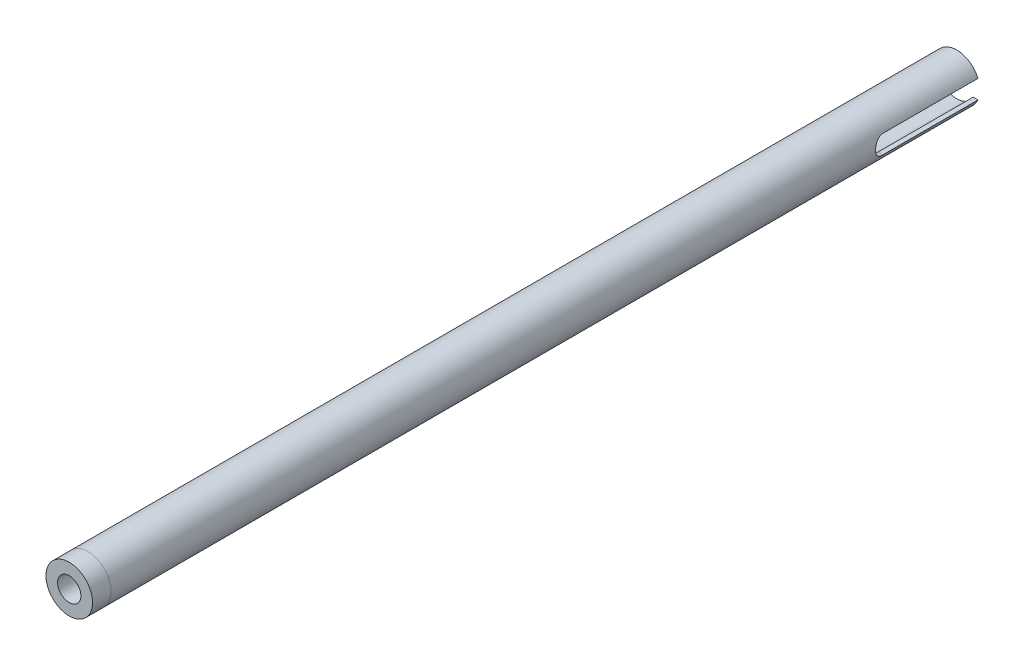
ISO-10303-21;
HEADER;
FILE_DESCRIPTION(('STEP AP214'),'2;1');
FILE_NAME('part.step','',(''),(''),'','','');
FILE_SCHEMA(('AUTOMOTIVE_DESIGN { 1 0 10303 214 1 1 1 1 }'));
ENDSEC;
DATA;
#1=APPLICATION_CONTEXT('core data for automotive mechanical design processes');
#2=APPLICATION_PROTOCOL_DEFINITION('international standard','automotive_design',2000,#1);
#3=PRODUCT_CONTEXT('',#1,'mechanical');
#4=PRODUCT('Part','Part','',(#3));
#5=PRODUCT_RELATED_PRODUCT_CATEGORY('part','',(#4));
#6=PRODUCT_DEFINITION_FORMATION('','',#4);
#7=PRODUCT_DEFINITION_CONTEXT('part definition',#1,'design');
#8=PRODUCT_DEFINITION('design','',#6,#7);
#9=PRODUCT_DEFINITION_SHAPE('','',#8);
#10=(LENGTH_UNIT() NAMED_UNIT(*) SI_UNIT(.MILLI.,.METRE.));
#11=(NAMED_UNIT(*) PLANE_ANGLE_UNIT() SI_UNIT($,.RADIAN.));
#12=(NAMED_UNIT(*) SI_UNIT($,.STERADIAN.) SOLID_ANGLE_UNIT());
#13=UNCERTAINTY_MEASURE_WITH_UNIT(LENGTH_MEASURE(1.E-05),#10,'distance_accuracy_value','');
#14=(GEOMETRIC_REPRESENTATION_CONTEXT(3) GLOBAL_UNCERTAINTY_ASSIGNED_CONTEXT((#13)) GLOBAL_UNIT_ASSIGNED_CONTEXT((#10,
#11,#12)) REPRESENTATION_CONTEXT('',''));
#15=CARTESIAN_POINT('',(0.,0.,0.));
#16=DIRECTION('',(0.,0.,1.));
#17=DIRECTION('',(1.,0.,0.));
#18=AXIS2_PLACEMENT_3D('',#15,#16,#17);
#19=CARTESIAN_POINT('',(0.,0.,-302.369232505343));
#20=DIRECTION('',(0.,0.,1.));
#21=DIRECTION('',(1.,0.,0.));
#22=AXIS2_PLACEMENT_3D('',#19,#20,#21);
#23=CYLINDRICAL_SURFACE('',#22,7.9375);
#24=CARTESIAN_POINT('',(0.,0.,-6.35));
#25=DIRECTION('',(0.,0.,1.));
#26=DIRECTION('',(1.,0.,0.));
#27=AXIS2_PLACEMENT_3D('',#24,#25,#26);
#28=CIRCLE('',#27,7.9375);
#29=CARTESIAN_POINT('',(7.9375,0.,-6.35));
#30=VERTEX_POINT('',#29);
#31=EDGE_CURVE('E165',#30,#30,#28,.T.);
#32=ORIENTED_EDGE('',*,*,#31,.F.);
#33=EDGE_LOOP('',(#32));
#34=FACE_BOUND('',#33,.T.);
#35=CARTESIAN_POINT('',(-7.2748389157424,3.175,-269.984232505343));
#36=CARTESIAN_POINT('',(-7.27482137043434,3.17501267173453,-269.89881238986));
#37=CARTESIAN_POINT('',(-7.27634297592672,3.17155313247793,-269.813401860298));
#38=CARTESIAN_POINT('',(-7.28233338484875,3.15778866907725,-269.64326985597));
#39=CARTESIAN_POINT('',(-7.28680106535325,3.14748635311323,-269.558548131111));
#40=CARTESIAN_POINT('',(-7.2985291631267,3.12019002880163,-269.390734431302));
#41=CARTESIAN_POINT('',(-7.30577831906487,3.10322299732752,-269.307637286543));
#42=CARTESIAN_POINT('',(-7.32282161153744,3.06278779397035,-269.143326184517));
#43=CARTESIAN_POINT('',(-7.33261590324725,3.03931922568674,-269.062112342404));
#44=CARTESIAN_POINT('',(-7.36535331460444,2.95952924342962,-268.822287519821));
#45=CARTESIAN_POINT('',(-7.39167595677839,2.89376893609239,-268.667162591017));
#46=CARTESIAN_POINT('',(-7.45033259991547,2.73920602658923,-268.370075164306));
#47=CARTESIAN_POINT('',(-7.48267254395243,2.65038060922872,-268.228125889088));
#48=CARTESIAN_POINT('',(-7.55175295441387,2.44684429809694,-267.953405119569));
#49=CARTESIAN_POINT('',(-7.58863404630155,2.33103943595687,-267.821477735057));
#50=CARTESIAN_POINT('',(-7.66147718953598,2.07914562663533,-267.578314851425));
#51=CARTESIAN_POINT('',(-7.69743902899202,1.94305205135846,-267.467084086497));
#52=CARTESIAN_POINT('',(-7.76611692840651,1.64778282664419,-267.264162887002));
#53=CARTESIAN_POINT('',(-7.79864638434712,1.48790317306356,-267.173428475598));
#54=CARTESIAN_POINT('',(-7.85502980346525,1.15369615984563,-267.020570922181));
#55=CARTESIAN_POINT('',(-7.87889360585224,0.979385463602722,-266.958415309563));
#56=CARTESIAN_POINT('',(-7.91022225039827,0.670405323433354,-266.877903665907));
#57=CARTESIAN_POINT('',(-7.92038443902171,0.537888188660439,-266.852225742498));
#58=CARTESIAN_POINT('',(-7.93061686811603,0.337231082382107,-266.826470659416));
#59=CARTESIAN_POINT('',(-7.93319257341971,0.269991647180298,-266.820012562136));
#60=CARTESIAN_POINT('',(-7.93663621925193,0.135173873369596,-266.811391544384));
#61=CARTESIAN_POINT('',(-7.93750363389236,0.0675954368175869,-266.809229946565));
#62=CARTESIAN_POINT('',(-7.9375,0.,-266.809232505343));
#63=B_SPLINE_CURVE_WITH_KNOTS('',3,(#35,#36,#37,#38,#39,#40,#41,#42,#43,#44,#45,#46,#47,#48,#49,
#50,#51,#52,#53,#54,#55,#56,#57,#58,#59,#60,#61,#62),.UNSPECIFIED.,.F.,.F.,(4,2,2,2,2,2,2,2,2,2,
2,2,2,4),(0.,0.256160797396612,0.512224013007058,0.767261264672238,1.02231406945471,
1.53142416248594,2.04103978047897,2.57679273649405,3.11266809162683,3.66991136029742,
4.22651992730645,4.63134321412666,4.8339937586662,5.03670667834028),.UNSPECIFIED.);
#64=CARTESIAN_POINT('',(-7.2748389157424,3.175,-269.984232505343));
#65=VERTEX_POINT('',#64);
#66=CARTESIAN_POINT('',(-7.9375,0.,-266.809232505343));
#67=VERTEX_POINT('',#66);
#68=EDGE_CURVE('E192',#65,#67,#63,.T.);
#69=ORIENTED_EDGE('',*,*,#68,.T.);
#70=CARTESIAN_POINT('',(-7.9375,0.,-266.809232505343));
#71=CARTESIAN_POINT('',(-7.93751279435796,-0.0856973243893185,-266.809220475174));
#72=CARTESIAN_POINT('',(-7.93611246860092,-0.171386675169291,-266.812701842646));
#73=CARTESIAN_POINT('',(-7.93058107051394,-0.342092796869088,-266.82655793798));
#74=CARTESIAN_POINT('',(-7.92645080745519,-0.427109759557717,-266.836930622964));
#75=CARTESIAN_POINT('',(-7.91557399086504,-0.595570690948319,-266.864427817031));
#76=CARTESIAN_POINT('',(-7.90883664469869,-0.67901912358001,-266.881528568304));
#77=CARTESIAN_POINT('',(-7.89293284658536,-0.844038966454646,-266.922295815777));
#78=CARTESIAN_POINT('',(-7.88376629739099,-0.925610301410303,-266.945962574834));
#79=CARTESIAN_POINT('',(-7.85297007832481,-1.16656173687588,-267.026470230533));
#80=CARTESIAN_POINT('',(-7.82802544143958,-1.32244720282989,-267.09286286341));
#81=CARTESIAN_POINT('',(-7.77174407779742,-1.62081902572888,-267.248908267403));
#82=CARTESIAN_POINT('',(-7.74040257287306,-1.7632952496653,-267.338578439466));
#83=CARTESIAN_POINT('',(-7.67287736621953,-2.03755465224644,-267.543032046981));
#84=CARTESIAN_POINT('',(-7.63654472176442,-2.16862853615059,-267.658718903713));
#85=CARTESIAN_POINT('',(-7.56380976030912,-2.41011022612819,-267.910013005422));
#86=CARTESIAN_POINT('',(-7.52740741976911,-2.52050895891189,-268.045628949904));
#87=CARTESIAN_POINT('',(-7.45683282624284,-2.72240939900242,-268.34032744477));
#88=CARTESIAN_POINT('',(-7.4228346735038,-2.81283701743189,-268.500191434686));
#89=CARTESIAN_POINT('',(-7.3633362219632,-2.96511894168388,-268.834317399482));
#90=CARTESIAN_POINT('',(-7.33782422493328,-3.02701262758154,-269.008559137241));
#91=CARTESIAN_POINT('',(-7.30424985403508,-3.10695047193342,-269.316862861893));
#92=CARTESIAN_POINT('',(-7.29331360019113,-3.13238569878909,-269.448721622779));
#93=CARTESIAN_POINT('',(-7.28227977674291,-3.15790858319001,-269.648438504473));
#94=CARTESIAN_POINT('',(-7.27949685702346,-3.16431127275807,-269.715386795232));
#95=CARTESIAN_POINT('',(-7.27577355567174,-3.17285909036155,-269.849628353099));
#96=CARTESIAN_POINT('',(-7.27483380475762,-3.1750027609968,-269.916921730396));
#97=CARTESIAN_POINT('',(-7.2748389157424,-3.175,-269.984232505343));
#98=B_SPLINE_CURVE_WITH_KNOTS('',3,(#70,#71,#72,#73,#74,#75,#76,#77,#78,#79,#80,#81,#82,#83,#84,
#85,#86,#87,#88,#89,#90,#91,#92,#93,#94,#95,#96,#97),.UNSPECIFIED.,.F.,.F.,(4,2,2,2,2,2,2,2,2,2,
2,2,2,4),(0.,0.256996432008007,0.513916713336978,0.769937797705386,1.02596913282157,
1.53722547809954,2.04886511530059,2.58219314099272,3.11575467201799,3.67332953074261,
4.2301325519037,4.63306130520181,4.83485003827446,5.03670780985612),.UNSPECIFIED.);
#99=CARTESIAN_POINT('',(-7.2748389157424,-3.175,-269.984232505343));
#100=VERTEX_POINT('',#99);
#101=EDGE_CURVE('E144',#67,#100,#98,.T.);
#102=ORIENTED_EDGE('',*,*,#101,.T.);
#103=DIRECTION('',(0.,0.,-1.));
#104=VECTOR('',#103,1.);
#105=CARTESIAN_POINT('',(-7.2748389157424,-3.175,-266.809232505343));
#106=LINE('',#105,#104);
#107=CARTESIAN_POINT('',(-7.2748389157424,-3.175,-302.369232505343));
#108=VERTEX_POINT('',#107);
#109=EDGE_CURVE('E139',#100,#108,#106,.T.);
#110=ORIENTED_EDGE('',*,*,#109,.T.);
#111=CARTESIAN_POINT('',(0.,0.,-302.369232505343));
#112=DIRECTION('',(0.,0.,1.));
#113=DIRECTION('',(1.,0.,0.));
#114=AXIS2_PLACEMENT_3D('',#111,#112,#113);
#115=CIRCLE('',#114,7.9375);
#116=CARTESIAN_POINT('',(7.2748389157424,-3.175,-302.369232505343));
#117=VERTEX_POINT('',#116);
#118=EDGE_CURVE('E142',#108,#117,#115,.T.);
#119=ORIENTED_EDGE('',*,*,#118,.T.);
#120=DIRECTION('',(0.,0.,-1.));
#121=VECTOR('',#120,1.);
#122=CARTESIAN_POINT('',(7.2748389157424,-3.175,-266.809232505343));
#123=LINE('',#122,#121);
#124=CARTESIAN_POINT('',(7.2748389157424,-3.175,-269.984232505343));
#125=VERTEX_POINT('',#124);
#126=EDGE_CURVE('E425',#125,#117,#123,.T.);
#127=ORIENTED_EDGE('',*,*,#126,.F.);
#128=CARTESIAN_POINT('',(7.2748389157424,-3.175,-269.984232505343));
#129=CARTESIAN_POINT('',(7.27482137043434,-3.17501267173453,-269.89881238986));
#130=CARTESIAN_POINT('',(7.27634297592672,-3.17155313247793,-269.813401860298));
#131=CARTESIAN_POINT('',(7.28233338484875,-3.15778866907725,-269.64326985597));
#132=CARTESIAN_POINT('',(7.28680106535325,-3.14748635311323,-269.558548131111));
#133=CARTESIAN_POINT('',(7.2985291631267,-3.12019002880163,-269.390734431302));
#134=CARTESIAN_POINT('',(7.30577831906487,-3.10322299732752,-269.307637286543));
#135=CARTESIAN_POINT('',(7.32282161153744,-3.06278779397035,-269.143326184517));
#136=CARTESIAN_POINT('',(7.33261590324725,-3.03931922568674,-269.062112342404));
#137=CARTESIAN_POINT('',(7.36535331460444,-2.95952924342962,-268.822287519821));
#138=CARTESIAN_POINT('',(7.39167595677839,-2.89376893609239,-268.667162591017));
#139=CARTESIAN_POINT('',(7.45033259991547,-2.73920602658923,-268.370075164306));
#140=CARTESIAN_POINT('',(7.48267254395243,-2.65038060922872,-268.228125889088));
#141=CARTESIAN_POINT('',(7.55175295441387,-2.44684429809694,-267.953405119569));
#142=CARTESIAN_POINT('',(7.58863404630155,-2.33103943595687,-267.821477735057));
#143=CARTESIAN_POINT('',(7.66147718953598,-2.07914562663533,-267.578314851425));
#144=CARTESIAN_POINT('',(7.69743902899202,-1.94305205135846,-267.467084086497));
#145=CARTESIAN_POINT('',(7.76611692840651,-1.64778282664419,-267.264162887002));
#146=CARTESIAN_POINT('',(7.79864638434712,-1.48790317306356,-267.173428475598));
#147=CARTESIAN_POINT('',(7.85502980346525,-1.15369615984563,-267.020570922181));
#148=CARTESIAN_POINT('',(7.87889360585224,-0.979385463602722,-266.958415309563));
#149=CARTESIAN_POINT('',(7.91022225039827,-0.670405323433354,-266.877903665907));
#150=CARTESIAN_POINT('',(7.92038443902171,-0.537888188660439,-266.852225742498));
#151=CARTESIAN_POINT('',(7.93061686811603,-0.337231082382107,-266.826470659416));
#152=CARTESIAN_POINT('',(7.93319257341971,-0.269991647180298,-266.820012562136));
#153=CARTESIAN_POINT('',(7.93663621925193,-0.135173873369596,-266.811391544384));
#154=CARTESIAN_POINT('',(7.93750363389236,-0.0675954368175869,-266.809229946565));
#155=CARTESIAN_POINT('',(7.9375,0.,-266.809232505343));
#156=B_SPLINE_CURVE_WITH_KNOTS('',3,(#128,#129,#130,#131,#132,#133,#134,#135,#136,#137,#138,
#139,#140,#141,#142,#143,#144,#145,#146,#147,#148,#149,#150,#151,#152,#153,#154,#155),
.UNSPECIFIED.,.F.,.F.,(4,2,2,2,2,2,2,2,2,2,2,2,2,4),(0.,0.256160797396612,0.512224013007058,
0.767261264672238,1.02231406945471,1.53142416248594,2.04103978047897,2.57679273649405,
3.11266809162683,3.66991136029742,4.22651992730645,4.63134321412666,4.8339937586662,
5.03670667834028),.UNSPECIFIED.);
#157=CARTESIAN_POINT('',(7.9375,0.,-266.809232505343));
#158=VERTEX_POINT('',#157);
#159=EDGE_CURVE('E85',#125,#158,#156,.T.);
#160=ORIENTED_EDGE('',*,*,#159,.T.);
#161=CARTESIAN_POINT('',(7.9375,0.,-266.809232505343));
#162=CARTESIAN_POINT('',(7.93751279435796,0.0856973243893185,-266.809220475174));
#163=CARTESIAN_POINT('',(7.93611246860092,0.171386675169291,-266.812701842646));
#164=CARTESIAN_POINT('',(7.93058107051394,0.342092796869088,-266.82655793798));
#165=CARTESIAN_POINT('',(7.92645080745519,0.427109759557717,-266.836930622964));
#166=CARTESIAN_POINT('',(7.91557399086504,0.595570690948319,-266.864427817031));
#167=CARTESIAN_POINT('',(7.90883664469869,0.67901912358001,-266.881528568304));
#168=CARTESIAN_POINT('',(7.89293284658536,0.844038966454646,-266.922295815777));
#169=CARTESIAN_POINT('',(7.88376629739099,0.925610301410303,-266.945962574834));
#170=CARTESIAN_POINT('',(7.85297007832481,1.16656173687588,-267.026470230533));
#171=CARTESIAN_POINT('',(7.82802544143958,1.32244720282989,-267.09286286341));
#172=CARTESIAN_POINT('',(7.77174407779742,1.62081902572888,-267.248908267403));
#173=CARTESIAN_POINT('',(7.74040257287306,1.7632952496653,-267.338578439466));
#174=CARTESIAN_POINT('',(7.67287736621953,2.03755465224644,-267.543032046981));
#175=CARTESIAN_POINT('',(7.63654472176442,2.16862853615059,-267.658718903713));
#176=CARTESIAN_POINT('',(7.56380976030912,2.41011022612819,-267.910013005422));
#177=CARTESIAN_POINT('',(7.52740741976911,2.52050895891189,-268.045628949904));
#178=CARTESIAN_POINT('',(7.45683282624284,2.72240939900242,-268.34032744477));
#179=CARTESIAN_POINT('',(7.4228346735038,2.81283701743189,-268.500191434686));
#180=CARTESIAN_POINT('',(7.3633362219632,2.96511894168388,-268.834317399482));
#181=CARTESIAN_POINT('',(7.33782422493328,3.02701262758154,-269.008559137241));
#182=CARTESIAN_POINT('',(7.30424985403508,3.10695047193342,-269.316862861893));
#183=CARTESIAN_POINT('',(7.29331360019113,3.13238569878909,-269.448721622779));
#184=CARTESIAN_POINT('',(7.28227977674291,3.15790858319001,-269.648438504473));
#185=CARTESIAN_POINT('',(7.27949685702346,3.16431127275807,-269.715386795232));
#186=CARTESIAN_POINT('',(7.27577355567174,3.17285909036155,-269.849628353099));
#187=CARTESIAN_POINT('',(7.27483380475762,3.1750027609968,-269.916921730396));
#188=CARTESIAN_POINT('',(7.2748389157424,3.175,-269.984232505343));
#189=B_SPLINE_CURVE_WITH_KNOTS('',3,(#161,#162,#163,#164,#165,#166,#167,#168,#169,#170,#171,
#172,#173,#174,#175,#176,#177,#178,#179,#180,#181,#182,#183,#184,#185,#186,#187,#188),
.UNSPECIFIED.,.F.,.F.,(4,2,2,2,2,2,2,2,2,2,2,2,2,4),(0.,0.256996432008007,0.513916713336978,
0.769937797705386,1.02596913282157,1.53722547809954,2.04886511530059,2.58219314099272,
3.11575467201799,3.67332953074261,4.2301325519037,4.63306130520181,4.83485003827446,
5.03670780985612),.UNSPECIFIED.);
#190=CARTESIAN_POINT('',(7.2748389157424,3.175,-269.984232505343));
#191=VERTEX_POINT('',#190);
#192=EDGE_CURVE('E71',#158,#191,#189,.T.);
#193=ORIENTED_EDGE('',*,*,#192,.T.);
#194=DIRECTION('',(0.,0.,-1.));
#195=VECTOR('',#194,1.);
#196=CARTESIAN_POINT('',(7.2748389157424,3.175,-266.809232505343));
#197=LINE('',#196,#195);
#198=CARTESIAN_POINT('',(7.2748389157424,3.175,-302.369232505343));
#199=VERTEX_POINT('',#198);
#200=EDGE_CURVE('E158',#191,#199,#197,.T.);
#201=ORIENTED_EDGE('',*,*,#200,.T.);
#202=CARTESIAN_POINT('',(-7.2748389157424,3.175,-302.369232505343));
#203=VERTEX_POINT('',#202);
#204=EDGE_CURVE('E164',#199,#203,#115,.T.);
#205=ORIENTED_EDGE('',*,*,#204,.T.);
#206=DIRECTION('',(0.,0.,-1.));
#207=VECTOR('',#206,1.);
#208=CARTESIAN_POINT('',(-7.2748389157424,3.175,-266.809232505343));
#209=LINE('',#208,#207);
#210=EDGE_CURVE('E418',#65,#203,#209,.T.);
#211=ORIENTED_EDGE('',*,*,#210,.F.);
#212=EDGE_LOOP('',(#69,#102,#110,#119,#127,#160,#193,#201,#205,#211));
#213=FACE_BOUND('',#212,.T.);
#214=ADVANCED_FACE('F61',(#34,#213),#23,.T.);
#215=CARTESIAN_POINT('',(0.,0.,-302.369232505343));
#216=DIRECTION('',(0.,0.,1.));
#217=DIRECTION('',(1.,0.,0.));
#218=AXIS2_PLACEMENT_3D('',#215,#216,#217);
#219=PLANE('',#218);
#220=DIRECTION('',(1.,0.,0.));
#221=VECTOR('',#220,1.);
#222=CARTESIAN_POINT('',(0.,-3.175,-302.369232505343));
#223=LINE('',#222,#221);
#224=CARTESIAN_POINT('',(-5.63085690548073,-3.175,-302.369232505343));
#225=VERTEX_POINT('',#224);
#226=EDGE_CURVE('E151',#108,#225,#223,.T.);
#227=ORIENTED_EDGE('',*,*,#226,.T.);
#228=CARTESIAN_POINT('',(0.,0.,-302.369232505343));
#229=DIRECTION('',(0.,0.,1.));
#230=DIRECTION('',(1.,0.,0.));
#231=AXIS2_PLACEMENT_3D('',#228,#229,#230);
#232=CIRCLE('',#231,6.4643);
#233=CARTESIAN_POINT('',(5.63085690548073,-3.175,-302.369232505343));
#234=VERTEX_POINT('',#233);
#235=EDGE_CURVE('E273',#225,#234,#232,.T.);
#236=ORIENTED_EDGE('',*,*,#235,.T.);
#237=DIRECTION('',(1.,0.,0.));
#238=VECTOR('',#237,1.);
#239=CARTESIAN_POINT('',(0.,-3.175,-302.369232505343));
#240=LINE('',#239,#238);
#241=EDGE_CURVE('E163',#234,#117,#240,.T.);
#242=ORIENTED_EDGE('',*,*,#241,.T.);
#243=ORIENTED_EDGE('',*,*,#118,.F.);
#244=EDGE_LOOP('',(#227,#236,#242,#243));
#245=FACE_BOUND('',#244,.T.);
#246=ADVANCED_FACE('F161',(#245),#219,.F.);
#247=CARTESIAN_POINT('',(0.,0.,-302.369232505343));
#248=DIRECTION('',(0.,0.,1.));
#249=DIRECTION('',(1.,0.,0.));
#250=AXIS2_PLACEMENT_3D('',#247,#248,#249);
#251=CYLINDRICAL_SURFACE('',#250,6.4643);
#252=CARTESIAN_POINT('',(0.,0.,-6.35));
#253=DIRECTION('',(0.,0.,1.));
#254=DIRECTION('',(1.,0.,0.));
#255=AXIS2_PLACEMENT_3D('',#252,#253,#254);
#256=CIRCLE('',#255,6.4643);
#257=CARTESIAN_POINT('',(6.4643,0.,-6.35));
#258=VERTEX_POINT('',#257);
#259=EDGE_CURVE('E147',#258,#258,#256,.T.);
#260=ORIENTED_EDGE('',*,*,#259,.T.);
#261=EDGE_LOOP('',(#260));
#262=FACE_BOUND('',#261,.T.);
#263=DIRECTION('',(0.,0.,-1.));
#264=VECTOR('',#263,1.);
#265=CARTESIAN_POINT('',(-5.63085690548073,-3.175,-266.809232505343));
#266=LINE('',#265,#264);
#267=CARTESIAN_POINT('',(-5.63085690548073,-3.175,-269.984232505343));
#268=VERTEX_POINT('',#267);
#269=EDGE_CURVE('E148',#268,#225,#266,.T.);
#270=ORIENTED_EDGE('',*,*,#269,.F.);
#271=CARTESIAN_POINT('',(-5.63085690548073,-3.175,-269.984232505343));
#272=CARTESIAN_POINT('',(-5.63083313994649,-3.17501475983035,-269.900855670622));
#273=CARTESIAN_POINT('',(-5.63270815771784,-3.17171623434453,-269.817491995453));
#274=CARTESIAN_POINT('',(-5.64007695954704,-3.15860868668088,-269.651486853358));
#275=CARTESIAN_POINT('',(-5.645568609108,-3.14880350463522,-269.568844989559));
#276=CARTESIAN_POINT('',(-5.65995160356269,-3.12287177657854,-269.405341724889));
#277=CARTESIAN_POINT('',(-5.66882360641349,-3.10678118209035,-269.324472912708));
#278=CARTESIAN_POINT('',(-5.68964253084949,-3.06848763641647,-269.164615532982));
#279=CARTESIAN_POINT('',(-5.70158978762268,-3.0462840189221,-269.085627171422));
#280=CARTESIAN_POINT('',(-5.74141867016874,-2.9709479042579,-268.85256892546));
#281=CARTESIAN_POINT('',(-5.77333273238342,-2.90901346570841,-268.701932384827));
#282=CARTESIAN_POINT('',(-5.84425759514897,-2.763754188191,-268.413077279992));
#283=CARTESIAN_POINT('',(-5.88327925344641,-2.68039654138926,-268.274878204929));
#284=CARTESIAN_POINT('',(-5.96775435279507,-2.48697819565355,-268.00293716669));
#285=CARTESIAN_POINT('',(-6.01347229172614,-2.37533204038057,-267.870402360341));
#286=CARTESIAN_POINT('',(-6.10404593063631,-2.13182339161096,-267.625026777263));
#287=CARTESIAN_POINT('',(-6.14890136897125,-1.99995486913048,-267.512191895284));
#288=CARTESIAN_POINT('',(-6.23619220514827,-1.70925564842441,-267.302208511364));
#289=CARTESIAN_POINT('',(-6.27828027392068,-1.54922894444793,-267.206558235635));
#290=CARTESIAN_POINT('',(-6.351789494002,-1.21302302470908,-267.044174330418));
#291=CARTESIAN_POINT('',(-6.3832266631188,-1.03686857473503,-266.977397236614));
#292=CARTESIAN_POINT('',(-6.42590822780063,-0.717171909263578,-266.887964589306));
#293=CARTESIAN_POINT('',(-6.4401838278065,-0.575906031157537,-266.858576344383));
#294=CARTESIAN_POINT('',(-6.45458743188517,-0.361448476439118,-266.829043624722));
#295=CARTESIAN_POINT('',(-6.45822048728408,-0.289432204318672,-266.821624179961));
#296=CARTESIAN_POINT('',(-6.46308007773031,-0.144952050292043,-266.8117157078));
#297=CARTESIAN_POINT('',(-6.46430565210199,-0.072488001271515,-266.809228648605));
#298=CARTESIAN_POINT('',(-6.4643,0.,-266.809232505343));
#299=B_SPLINE_CURVE_WITH_KNOTS('',3,(#271,#272,#273,#274,#275,#276,#277,#278,#279,#280,#281,
#282,#283,#284,#285,#286,#287,#288,#289,#290,#291,#292,#293,#294,#295,#296,#297,#298),
.UNSPECIFIED.,.F.,.F.,(4,2,2,2,2,2,2,2,2,2,2,2,2,4),(0.,0.250022608278555,0.499897788003946,
0.748364171658939,0.996857648438736,1.49241740389683,1.9887406369739,2.52413245916958,
3.05968421153491,3.63008006190818,4.19961425046545,4.63293550793411,4.85021333970384,
5.06757785591817),.UNSPECIFIED.);
#300=CARTESIAN_POINT('',(-6.4643,0.,-266.809232505343));
#301=VERTEX_POINT('',#300);
#302=EDGE_CURVE('E219',#268,#301,#299,.T.);
#303=ORIENTED_EDGE('',*,*,#302,.T.);
#304=CARTESIAN_POINT('',(-6.4643,0.,-266.809232505343));
#305=CARTESIAN_POINT('',(-6.46431471784482,0.0839947643435499,-266.809219161216));
#306=CARTESIAN_POINT('',(-6.46266329267846,0.167980128010398,-266.812565260585));
#307=CARTESIAN_POINT('',(-6.45613851930725,0.335267070847885,-266.825872714189));
#308=CARTESIAN_POINT('',(-6.45126643524264,0.418568905327645,-266.835831472897));
#309=CARTESIAN_POINT('',(-6.4384393661228,0.583520093709583,-266.862201515366));
#310=CARTESIAN_POINT('',(-6.43049830091841,0.665175181914776,-266.878583669613));
#311=CARTESIAN_POINT('',(-6.41174605062734,0.826621713408832,-266.917601209367));
#312=CARTESIAN_POINT('',(-6.40093469346325,0.906413044651103,-266.940236969788));
#313=CARTESIAN_POINT('',(-6.3645999533627,1.14200454475575,-267.01713653388));
#314=CARTESIAN_POINT('',(-6.33514826225986,1.29435730209625,-267.080447167063));
#315=CARTESIAN_POINT('',(-6.26847721301058,1.5861501237047,-267.228938666893));
#316=CARTESIAN_POINT('',(-6.23125016174678,1.7255772002446,-267.314141213259));
#317=CARTESIAN_POINT('',(-6.14993667819984,1.99664965861334,-267.509655159388));
#318=CARTESIAN_POINT('',(-6.10557667432165,2.12736555519216,-267.621142019038));
#319=CARTESIAN_POINT('',(-6.01591119010694,2.36910305567937,-267.863544442221));
#320=CARTESIAN_POINT('',(-5.97060501254448,2.48010951928959,-267.994474801207));
#321=CARTESIAN_POINT('',(-5.88028635793905,2.68759195973765,-268.283797139949));
#322=CARTESIAN_POINT('',(-5.83554983812279,2.78235777578918,-268.443511242603));
#323=CARTESIAN_POINT('',(-5.75613746809778,2.94315382396594,-268.778862487179));
#324=CARTESIAN_POINT('',(-5.72144095718824,3.00924320962384,-268.954465939033));
#325=CARTESIAN_POINT('',(-5.67404956693615,3.09744900867387,-269.272470240719));
#326=CARTESIAN_POINT('',(-5.65804978215016,3.12636521602239,-269.412494930661));
#327=CARTESIAN_POINT('',(-5.64184153899281,3.1554574998571,-269.625243229271));
#328=CARTESIAN_POINT('',(-5.63773701667688,3.16277482388528,-269.696753117376));
#329=CARTESIAN_POINT('',(-5.63223913004552,3.17254960488947,-269.840244179147));
#330=CARTESIAN_POINT('',(-5.6308471601211,3.17500456237039,-269.912225576128));
#331=CARTESIAN_POINT('',(-5.63085690548073,3.175,-269.984232505343));
#332=B_SPLINE_CURVE_WITH_KNOTS('',3,(#304,#305,#306,#307,#308,#309,#310,#311,#312,#313,#314,
#315,#316,#317,#318,#319,#320,#321,#322,#323,#324,#325,#326,#327,#328,#329,#330,#331),
.UNSPECIFIED.,.F.,.F.,(4,2,2,2,2,2,2,2,2,2,2,2,2,4),(0.,0.251885801688016,0.503672794384369,
0.754330922106977,1.00500408047846,1.50534146760879,2.00617626510683,2.53624961383844,
3.06672840649523,3.63692439554962,4.20593853113138,4.63586569132644,4.85167139809474,
5.06758801082739),.UNSPECIFIED.);
#333=CARTESIAN_POINT('',(-5.63085690548073,3.175,-269.984232505343));
#334=VERTEX_POINT('',#333);
#335=EDGE_CURVE('E184',#301,#334,#332,.T.);
#336=ORIENTED_EDGE('',*,*,#335,.T.);
#337=DIRECTION('',(0.,0.,-1.));
#338=VECTOR('',#337,1.);
#339=CARTESIAN_POINT('',(-5.63085690548073,3.175,-266.809232505343));
#340=LINE('',#339,#338);
#341=CARTESIAN_POINT('',(-5.63085690548073,3.175,-302.369232505343));
#342=VERTEX_POINT('',#341);
#343=EDGE_CURVE('E415',#334,#342,#340,.T.);
#344=ORIENTED_EDGE('',*,*,#343,.T.);
#345=CARTESIAN_POINT('',(5.63085690548073,3.175,-302.369232505343));
#346=VERTEX_POINT('',#345);
#347=EDGE_CURVE('E170',#346,#342,#232,.T.);
#348=ORIENTED_EDGE('',*,*,#347,.F.);
#349=DIRECTION('',(0.,0.,-1.));
#350=VECTOR('',#349,1.);
#351=CARTESIAN_POINT('',(5.63085690548073,3.175,-266.809232505343));
#352=LINE('',#351,#350);
#353=CARTESIAN_POINT('',(5.63085690548073,3.175,-269.984232505343));
#354=VERTEX_POINT('',#353);
#355=EDGE_CURVE('E267',#354,#346,#352,.T.);
#356=ORIENTED_EDGE('',*,*,#355,.F.);
#357=CARTESIAN_POINT('',(5.63085690548073,3.175,-269.984232505343));
#358=CARTESIAN_POINT('',(5.63083313994649,3.17501475983035,-269.900855670622));
#359=CARTESIAN_POINT('',(5.63270815771784,3.17171623434453,-269.817491995453));
#360=CARTESIAN_POINT('',(5.64007695954704,3.15860868668088,-269.651486853358));
#361=CARTESIAN_POINT('',(5.645568609108,3.14880350463522,-269.568844989559));
#362=CARTESIAN_POINT('',(5.65995160356269,3.12287177657854,-269.405341724889));
#363=CARTESIAN_POINT('',(5.66882360641349,3.10678118209035,-269.324472912708));
#364=CARTESIAN_POINT('',(5.68964253084949,3.06848763641647,-269.164615532982));
#365=CARTESIAN_POINT('',(5.70158978762268,3.0462840189221,-269.085627171422));
#366=CARTESIAN_POINT('',(5.74141867016874,2.9709479042579,-268.85256892546));
#367=CARTESIAN_POINT('',(5.77333273238342,2.90901346570841,-268.701932384827));
#368=CARTESIAN_POINT('',(5.84425759514897,2.763754188191,-268.413077279992));
#369=CARTESIAN_POINT('',(5.88327925344641,2.68039654138926,-268.274878204929));
#370=CARTESIAN_POINT('',(5.96775435279507,2.48697819565355,-268.00293716669));
#371=CARTESIAN_POINT('',(6.01347229172614,2.37533204038057,-267.870402360341));
#372=CARTESIAN_POINT('',(6.10404593063631,2.13182339161096,-267.625026777263));
#373=CARTESIAN_POINT('',(6.14890136897125,1.99995486913048,-267.512191895284));
#374=CARTESIAN_POINT('',(6.23619220514827,1.70925564842441,-267.302208511364));
#375=CARTESIAN_POINT('',(6.27828027392068,1.54922894444793,-267.206558235635));
#376=CARTESIAN_POINT('',(6.351789494002,1.21302302470908,-267.044174330418));
#377=CARTESIAN_POINT('',(6.3832266631188,1.03686857473503,-266.977397236614));
#378=CARTESIAN_POINT('',(6.42590822780063,0.717171909263578,-266.887964589306));
#379=CARTESIAN_POINT('',(6.4401838278065,0.575906031157537,-266.858576344383));
#380=CARTESIAN_POINT('',(6.45458743188517,0.361448476439118,-266.829043624722));
#381=CARTESIAN_POINT('',(6.45822048728408,0.289432204318672,-266.821624179961));
#382=CARTESIAN_POINT('',(6.46308007773031,0.144952050292043,-266.8117157078));
#383=CARTESIAN_POINT('',(6.46430565210199,0.072488001271515,-266.809228648605));
#384=CARTESIAN_POINT('',(6.4643,0.,-266.809232505343));
#385=B_SPLINE_CURVE_WITH_KNOTS('',3,(#357,#358,#359,#360,#361,#362,#363,#364,#365,#366,#367,
#368,#369,#370,#371,#372,#373,#374,#375,#376,#377,#378,#379,#380,#381,#382,#383,#384),
.UNSPECIFIED.,.F.,.F.,(4,2,2,2,2,2,2,2,2,2,2,2,2,4),(0.,0.250022608278555,0.499897788003946,
0.748364171658939,0.996857648438736,1.49241740389683,1.9887406369739,2.52413245916958,
3.05968421153491,3.63008006190818,4.19961425046545,4.63293550793411,4.85021333970384,
5.06757785591817),.UNSPECIFIED.);
#386=CARTESIAN_POINT('',(6.4643,0.,-266.809232505343));
#387=VERTEX_POINT('',#386);
#388=EDGE_CURVE('E13',#354,#387,#385,.T.);
#389=ORIENTED_EDGE('',*,*,#388,.T.);
#390=CARTESIAN_POINT('',(6.4643,0.,-266.809232505343));
#391=CARTESIAN_POINT('',(6.46431471784482,-0.0839947643435499,-266.809219161216));
#392=CARTESIAN_POINT('',(6.46266329267846,-0.167980128010398,-266.812565260585));
#393=CARTESIAN_POINT('',(6.45613851930725,-0.335267070847885,-266.825872714189));
#394=CARTESIAN_POINT('',(6.45126643524264,-0.418568905327645,-266.835831472897));
#395=CARTESIAN_POINT('',(6.4384393661228,-0.583520093709583,-266.862201515366));
#396=CARTESIAN_POINT('',(6.43049830091841,-0.665175181914776,-266.878583669613));
#397=CARTESIAN_POINT('',(6.41174605062734,-0.826621713408832,-266.917601209367));
#398=CARTESIAN_POINT('',(6.40093469346325,-0.906413044651103,-266.940236969788));
#399=CARTESIAN_POINT('',(6.3645999533627,-1.14200454475575,-267.01713653388));
#400=CARTESIAN_POINT('',(6.33514826225986,-1.29435730209625,-267.080447167063));
#401=CARTESIAN_POINT('',(6.26847721301058,-1.5861501237047,-267.228938666893));
#402=CARTESIAN_POINT('',(6.23125016174678,-1.7255772002446,-267.314141213259));
#403=CARTESIAN_POINT('',(6.14993667819984,-1.99664965861334,-267.509655159388));
#404=CARTESIAN_POINT('',(6.10557667432165,-2.12736555519216,-267.621142019038));
#405=CARTESIAN_POINT('',(6.01591119010694,-2.36910305567937,-267.863544442221));
#406=CARTESIAN_POINT('',(5.97060501254448,-2.48010951928959,-267.994474801207));
#407=CARTESIAN_POINT('',(5.88028635793905,-2.68759195973765,-268.283797139949));
#408=CARTESIAN_POINT('',(5.83554983812279,-2.78235777578918,-268.443511242603));
#409=CARTESIAN_POINT('',(5.75613746809778,-2.94315382396594,-268.778862487179));
#410=CARTESIAN_POINT('',(5.72144095718824,-3.00924320962384,-268.954465939033));
#411=CARTESIAN_POINT('',(5.67404956693615,-3.09744900867387,-269.272470240719));
#412=CARTESIAN_POINT('',(5.65804978215016,-3.12636521602239,-269.412494930661));
#413=CARTESIAN_POINT('',(5.64184153899281,-3.1554574998571,-269.625243229271));
#414=CARTESIAN_POINT('',(5.63773701667688,-3.16277482388528,-269.696753117376));
#415=CARTESIAN_POINT('',(5.63223913004552,-3.17254960488947,-269.840244179147));
#416=CARTESIAN_POINT('',(5.6308471601211,-3.17500456237039,-269.912225576128));
#417=CARTESIAN_POINT('',(5.63085690548073,-3.175,-269.984232505343));
#418=B_SPLINE_CURVE_WITH_KNOTS('',3,(#390,#391,#392,#393,#394,#395,#396,#397,#398,#399,#400,
#401,#402,#403,#404,#405,#406,#407,#408,#409,#410,#411,#412,#413,#414,#415,#416,#417),
.UNSPECIFIED.,.F.,.F.,(4,2,2,2,2,2,2,2,2,2,2,2,2,4),(0.,0.251885801688016,0.503672794384369,
0.754330922106977,1.00500408047846,1.50534146760879,2.00617626510683,2.53624961383844,
3.06672840649523,3.63692439554962,4.20593853113138,4.63586569132644,4.85167139809474,
5.06758801082739),.UNSPECIFIED.);
#419=CARTESIAN_POINT('',(5.63085690548073,-3.175,-269.984232505343));
#420=VERTEX_POINT('',#419);
#421=EDGE_CURVE('E235',#387,#420,#418,.T.);
#422=ORIENTED_EDGE('',*,*,#421,.T.);
#423=DIRECTION('',(0.,0.,-1.));
#424=VECTOR('',#423,1.);
#425=CARTESIAN_POINT('',(5.63085690548073,-3.175,-266.809232505343));
#426=LINE('',#425,#424);
#427=EDGE_CURVE('E269',#420,#234,#426,.T.);
#428=ORIENTED_EDGE('',*,*,#427,.T.);
#429=ORIENTED_EDGE('',*,*,#235,.F.);
#430=EDGE_LOOP('',(#270,#303,#336,#344,#348,#356,#389,#422,#428,#429));
#431=FACE_BOUND('',#430,.T.);
#432=ADVANCED_FACE('F199',(#262,#431),#251,.F.);
#433=ORIENTED_EDGE('',*,*,#347,.T.);
#434=DIRECTION('',(1.,0.,0.));
#435=VECTOR('',#434,1.);
#436=CARTESIAN_POINT('',(0.,3.175,-302.369232505343));
#437=LINE('',#436,#435);
#438=EDGE_CURVE('E157',#203,#342,#437,.T.);
#439=ORIENTED_EDGE('',*,*,#438,.F.);
#440=ORIENTED_EDGE('',*,*,#204,.F.);
#441=DIRECTION('',(1.,0.,0.));
#442=VECTOR('',#441,1.);
#443=CARTESIAN_POINT('',(0.,3.175,-302.369232505343));
#444=LINE('',#443,#442);
#445=EDGE_CURVE('E251',#346,#199,#444,.T.);
#446=ORIENTED_EDGE('',*,*,#445,.F.);
#447=EDGE_LOOP('',(#433,#439,#440,#446));
#448=FACE_BOUND('',#447,.T.);
#449=ADVANCED_FACE('F284',(#448),#219,.F.);
#450=CARTESIAN_POINT('',(0.,0.,-6.35));
#451=DIRECTION('',(0.,0.,1.));
#452=DIRECTION('',(1.,0.,0.));
#453=AXIS2_PLACEMENT_3D('',#450,#451,#452);
#454=PLANE('',#453);
#455=ORIENTED_EDGE('',*,*,#259,.F.);
#456=EDGE_LOOP('',(#455));
#457=FACE_BOUND('',#456,.T.);
#458=ORIENTED_EDGE('',*,*,#31,.T.);
#459=EDGE_LOOP('',(#458));
#460=FACE_BOUND('',#459,.T.);
#461=ADVANCED_FACE('F281',(#457,#460),#454,.T.);
#462=CARTESIAN_POINT('',(0.,3.175,-266.809232505343));
#463=DIRECTION('',(0.,1.,0.));
#464=DIRECTION('',(0.,0.,1.));
#465=AXIS2_PLACEMENT_3D('',#462,#463,#464);
#466=PLANE('',#465);
#467=ORIENTED_EDGE('',*,*,#200,.F.);
#468=DIRECTION('',(1.,0.,0.));
#469=VECTOR('',#468,1.);
#470=CARTESIAN_POINT('',(5.63085690548073,3.175,-269.984232505343));
#471=LINE('',#470,#469);
#472=EDGE_CURVE('E182',#191,#354,#471,.F.);
#473=ORIENTED_EDGE('',*,*,#472,.T.);
#474=ORIENTED_EDGE('',*,*,#355,.T.);
#475=ORIENTED_EDGE('',*,*,#445,.T.);
#476=EDGE_LOOP('',(#467,#473,#474,#475));
#477=FACE_BOUND('',#476,.T.);
#478=ADVANCED_FACE('F264',(#477),#466,.F.);
#479=CARTESIAN_POINT('',(0.,-3.175,-266.809232505343));
#480=DIRECTION('',(0.,1.,0.));
#481=DIRECTION('',(0.,0.,1.));
#482=AXIS2_PLACEMENT_3D('',#479,#480,#481);
#483=PLANE('',#482);
#484=ORIENTED_EDGE('',*,*,#427,.F.);
#485=DIRECTION('',(1.,0.,0.));
#486=VECTOR('',#485,1.);
#487=CARTESIAN_POINT('',(0.,-3.175,-269.984232505343));
#488=LINE('',#487,#486);
#489=EDGE_CURVE('E179',#420,#125,#488,.T.);
#490=ORIENTED_EDGE('',*,*,#489,.T.);
#491=ORIENTED_EDGE('',*,*,#126,.T.);
#492=ORIENTED_EDGE('',*,*,#241,.F.);
#493=EDGE_LOOP('',(#484,#490,#491,#492));
#494=FACE_BOUND('',#493,.T.);
#495=ADVANCED_FACE('F359',(#494),#483,.T.);
#496=CARTESIAN_POINT('',(0.,-3.175,-266.809232505343));
#497=DIRECTION('',(0.,1.,0.));
#498=DIRECTION('',(0.,0.,1.));
#499=AXIS2_PLACEMENT_3D('',#496,#497,#498);
#500=PLANE('',#499);
#501=ORIENTED_EDGE('',*,*,#109,.F.);
#502=DIRECTION('',(1.,0.,0.));
#503=VECTOR('',#502,1.);
#504=CARTESIAN_POINT('',(0.,-3.175,-269.984232505343));
#505=LINE('',#504,#503);
#506=EDGE_CURVE('E177',#100,#268,#505,.T.);
#507=ORIENTED_EDGE('',*,*,#506,.T.);
#508=ORIENTED_EDGE('',*,*,#269,.T.);
#509=ORIENTED_EDGE('',*,*,#226,.F.);
#510=EDGE_LOOP('',(#501,#507,#508,#509));
#511=FACE_BOUND('',#510,.T.);
#512=ADVANCED_FACE('F152',(#511),#500,.T.);
#513=CARTESIAN_POINT('',(0.,3.175,-266.809232505343));
#514=DIRECTION('',(0.,1.,0.));
#515=DIRECTION('',(0.,0.,1.));
#516=AXIS2_PLACEMENT_3D('',#513,#514,#515);
#517=PLANE('',#516);
#518=ORIENTED_EDGE('',*,*,#343,.F.);
#519=DIRECTION('',(1.,0.,0.));
#520=VECTOR('',#519,1.);
#521=CARTESIAN_POINT('',(-7.2748389157424,3.175,-269.984232505343));
#522=LINE('',#521,#520);
#523=EDGE_CURVE('E168',#334,#65,#522,.F.);
#524=ORIENTED_EDGE('',*,*,#523,.T.);
#525=ORIENTED_EDGE('',*,*,#210,.T.);
#526=ORIENTED_EDGE('',*,*,#438,.T.);
#527=EDGE_LOOP('',(#518,#524,#525,#526));
#528=FACE_BOUND('',#527,.T.);
#529=ADVANCED_FACE('F214',(#528),#517,.F.);
#530=CARTESIAN_POINT('',(0.,0.,-269.984232505343));
#531=DIRECTION('',(1.,0.,0.));
#532=DIRECTION('',(0.,0.,-1.));
#533=AXIS2_PLACEMENT_3D('',#530,#531,#532);
#534=CYLINDRICAL_SURFACE('',#533,3.175);
#535=ORIENTED_EDGE('',*,*,#506,.F.);
#536=ORIENTED_EDGE('',*,*,#101,.F.);
#537=DIRECTION('',(1.,0.,0.));
#538=VECTOR('',#537,1.);
#539=CARTESIAN_POINT('',(0.,0.,-266.809232505343));
#540=LINE('',#539,#538);
#541=EDGE_CURVE('E249',#301,#67,#540,.F.);
#542=ORIENTED_EDGE('',*,*,#541,.F.);
#543=ORIENTED_EDGE('',*,*,#302,.F.);
#544=EDGE_LOOP('',(#535,#536,#542,#543));
#545=FACE_BOUND('',#544,.T.);
#546=ADVANCED_FACE('F207',(#545),#534,.F.);
#547=CARTESIAN_POINT('',(0.,0.,-269.984232505343));
#548=DIRECTION('',(-1.,0.,0.));
#549=DIRECTION('',(0.,0.,1.));
#550=AXIS2_PLACEMENT_3D('',#547,#548,#549);
#551=CYLINDRICAL_SURFACE('',#550,3.175);
#552=ORIENTED_EDGE('',*,*,#68,.F.);
#553=ORIENTED_EDGE('',*,*,#523,.F.);
#554=ORIENTED_EDGE('',*,*,#335,.F.);
#555=ORIENTED_EDGE('',*,*,#541,.T.);
#556=EDGE_LOOP('',(#552,#553,#554,#555));
#557=FACE_BOUND('',#556,.T.);
#558=ADVANCED_FACE('F203',(#557),#551,.F.);
#559=CARTESIAN_POINT('',(0.,0.,-269.984232505343));
#560=DIRECTION('',(-1.,0.,0.));
#561=DIRECTION('',(0.,0.,1.));
#562=AXIS2_PLACEMENT_3D('',#559,#560,#561);
#563=CYLINDRICAL_SURFACE('',#562,3.175);
#564=DIRECTION('',(1.,0.,0.));
#565=VECTOR('',#564,1.);
#566=CARTESIAN_POINT('',(7.2748389157424,0.,-266.809232505343));
#567=LINE('',#566,#565);
#568=EDGE_CURVE('E66',#387,#158,#567,.T.);
#569=ORIENTED_EDGE('',*,*,#568,.F.);
#570=ORIENTED_EDGE('',*,*,#388,.F.);
#571=ORIENTED_EDGE('',*,*,#472,.F.);
#572=ORIENTED_EDGE('',*,*,#192,.F.);
#573=EDGE_LOOP('',(#569,#570,#571,#572));
#574=FACE_BOUND('',#573,.T.);
#575=ADVANCED_FACE('F63',(#574),#563,.F.);
#576=CARTESIAN_POINT('',(0.,0.,-269.984232505343));
#577=DIRECTION('',(1.,0.,0.));
#578=DIRECTION('',(0.,0.,-1.));
#579=AXIS2_PLACEMENT_3D('',#576,#577,#578);
#580=CYLINDRICAL_SURFACE('',#579,3.175);
#581=ORIENTED_EDGE('',*,*,#421,.F.);
#582=ORIENTED_EDGE('',*,*,#568,.T.);
#583=ORIENTED_EDGE('',*,*,#159,.F.);
#584=ORIENTED_EDGE('',*,*,#489,.F.);
#585=EDGE_LOOP('',(#581,#582,#583,#584));
#586=FACE_BOUND('',#585,.T.);
#587=ADVANCED_FACE('F216',(#586),#580,.F.);
#588=CLOSED_SHELL('',(#214,#246,#432,#449,#461,#478,#495,#512,#529,#546,#558,#575,#587));
#589=MANIFOLD_SOLID_BREP('B2',#588);
#590=CARTESIAN_POINT('',(0.,0.,-6.35));
#591=DIRECTION('',(0.,0.,1.));
#592=DIRECTION('',(1.,0.,0.));
#593=AXIS2_PLACEMENT_3D('',#590,#591,#592);
#594=CYLINDRICAL_SURFACE('',#593,7.9375);
#595=CARTESIAN_POINT('',(0.,0.,-6.35));
#596=DIRECTION('',(0.,0.,1.));
#597=DIRECTION('',(1.,0.,0.));
#598=AXIS2_PLACEMENT_3D('',#595,#596,#597);
#599=CIRCLE('',#598,7.9375);
#600=CARTESIAN_POINT('',(7.9375,0.,-6.35));
#601=VERTEX_POINT('',#600);
#602=EDGE_CURVE('E60',#601,#601,#599,.T.);
#603=ORIENTED_EDGE('',*,*,#602,.T.);
#604=EDGE_LOOP('',(#603));
#605=FACE_BOUND('',#604,.T.);
#606=CARTESIAN_POINT('',(0.,0.,0.));
#607=DIRECTION('',(0.,0.,1.));
#608=DIRECTION('',(1.,0.,0.));
#609=AXIS2_PLACEMENT_3D('',#606,#607,#608);
#610=CIRCLE('',#609,7.9375);
#611=CARTESIAN_POINT('',(7.9375,0.,0.));
#612=VERTEX_POINT('',#611);
#613=EDGE_CURVE('E463',#612,#612,#610,.T.);
#614=ORIENTED_EDGE('',*,*,#613,.F.);
#615=EDGE_LOOP('',(#614));
#616=FACE_BOUND('',#615,.T.);
#617=ADVANCED_FACE('F452',(#605,#616),#594,.T.);
#618=CARTESIAN_POINT('',(0.,0.,-6.35));
#619=DIRECTION('',(0.,0.,1.));
#620=DIRECTION('',(1.,0.,0.));
#621=AXIS2_PLACEMENT_3D('',#618,#619,#620);
#622=CYLINDRICAL_SURFACE('',#621,3.96875);
#623=CARTESIAN_POINT('',(0.,0.,0.));
#624=DIRECTION('',(0.,0.,1.));
#625=DIRECTION('',(1.,0.,0.));
#626=AXIS2_PLACEMENT_3D('',#623,#624,#625);
#627=CIRCLE('',#626,3.96875);
#628=CARTESIAN_POINT('',(3.96875,0.,0.));
#629=VERTEX_POINT('',#628);
#630=EDGE_CURVE('E455',#629,#629,#627,.T.);
#631=ORIENTED_EDGE('',*,*,#630,.T.);
#632=EDGE_LOOP('',(#631));
#633=FACE_BOUND('',#632,.T.);
#634=CARTESIAN_POINT('',(0.,0.,-15.875));
#635=DIRECTION('',(0.,0.,1.));
#636=DIRECTION('',(1.,0.,0.));
#637=AXIS2_PLACEMENT_3D('',#634,#635,#636);
#638=CIRCLE('',#637,3.96875);
#639=CARTESIAN_POINT('',(3.96875,0.,-15.875));
#640=VERTEX_POINT('',#639);
#641=EDGE_CURVE('E475',#640,#640,#638,.T.);
#642=ORIENTED_EDGE('',*,*,#641,.F.);
#643=EDGE_LOOP('',(#642));
#644=FACE_BOUND('',#643,.T.);
#645=ADVANCED_FACE('F483',(#633,#644),#622,.F.);
#646=CARTESIAN_POINT('',(0.,0.,-6.35));
#647=DIRECTION('',(0.,0.,1.));
#648=DIRECTION('',(1.,0.,0.));
#649=AXIS2_PLACEMENT_3D('',#646,#647,#648);
#650=PLANE('',#649);
#651=CARTESIAN_POINT('',(0.,0.,-6.35));
#652=DIRECTION('',(0.,0.,1.));
#653=DIRECTION('',(1.,0.,0.));
#654=AXIS2_PLACEMENT_3D('',#651,#652,#653);
#655=CIRCLE('',#654,6.4643);
#656=CARTESIAN_POINT('',(6.4643,0.,-6.35));
#657=VERTEX_POINT('',#656);
#658=EDGE_CURVE('E465',#657,#657,#655,.T.);
#659=ORIENTED_EDGE('',*,*,#658,.T.);
#660=EDGE_LOOP('',(#659));
#661=FACE_BOUND('',#660,.T.);
#662=ORIENTED_EDGE('',*,*,#602,.F.);
#663=EDGE_LOOP('',(#662));
#664=FACE_BOUND('',#663,.T.);
#665=ADVANCED_FACE('F485',(#661,#664),#650,.F.);
#666=CARTESIAN_POINT('',(0.,0.,0.));
#667=DIRECTION('',(0.,0.,1.));
#668=DIRECTION('',(1.,0.,0.));
#669=AXIS2_PLACEMENT_3D('',#666,#667,#668);
#670=PLANE('',#669);
#671=ORIENTED_EDGE('',*,*,#613,.T.);
#672=EDGE_LOOP('',(#671));
#673=FACE_BOUND('',#672,.T.);
#674=ORIENTED_EDGE('',*,*,#630,.F.);
#675=EDGE_LOOP('',(#674));
#676=FACE_BOUND('',#675,.T.);
#677=ADVANCED_FACE('F491',(#673,#676),#670,.T.);
#678=CARTESIAN_POINT('',(0.,0.,-15.875));
#679=DIRECTION('',(0.,0.,1.));
#680=DIRECTION('',(1.,0.,0.));
#681=AXIS2_PLACEMENT_3D('',#678,#679,#680);
#682=CYLINDRICAL_SURFACE('',#681,6.4643);
#683=CARTESIAN_POINT('',(0.,0.,-15.875));
#684=DIRECTION('',(0.,0.,1.));
#685=DIRECTION('',(1.,0.,0.));
#686=AXIS2_PLACEMENT_3D('',#683,#684,#685);
#687=CIRCLE('',#686,6.4643);
#688=CARTESIAN_POINT('',(6.4643,0.,-15.875));
#689=VERTEX_POINT('',#688);
#690=EDGE_CURVE('E468',#689,#689,#687,.T.);
#691=CARTESIAN_POINT('',(6.4643,0.,-15.875));
#692=CARTESIAN_POINT('',(6.4643,0.,-15.77578125));
#693=CARTESIAN_POINT('',(6.4643,0.,-15.6765625));
#694=CARTESIAN_POINT('',(6.4643,0.,-15.478125));
#695=CARTESIAN_POINT('',(6.4643,0.,-15.37890625));
#696=CARTESIAN_POINT('',(6.4643,0.,-15.18046875));
#697=CARTESIAN_POINT('',(6.4643,0.,-15.08125));
#698=CARTESIAN_POINT('',(6.4643,0.,-14.8828125));
#699=CARTESIAN_POINT('',(6.4643,0.,-14.78359375));
#700=CARTESIAN_POINT('',(6.4643,0.,-14.58515625));
#701=CARTESIAN_POINT('',(6.4643,0.,-14.4859375));
#702=CARTESIAN_POINT('',(6.4643,0.,-14.2875));
#703=CARTESIAN_POINT('',(6.4643,0.,-14.18828125));
#704=CARTESIAN_POINT('',(6.4643,0.,-13.98984375));
#705=CARTESIAN_POINT('',(6.4643,0.,-13.890625));
#706=CARTESIAN_POINT('',(6.4643,0.,-13.6921875));
#707=CARTESIAN_POINT('',(6.4643,0.,-13.59296875));
#708=CARTESIAN_POINT('',(6.4643,0.,-13.39453125));
#709=CARTESIAN_POINT('',(6.4643,0.,-13.2953125));
#710=CARTESIAN_POINT('',(6.4643,0.,-13.096875));
#711=CARTESIAN_POINT('',(6.4643,0.,-12.99765625));
#712=CARTESIAN_POINT('',(6.4643,0.,-12.79921875));
#713=CARTESIAN_POINT('',(6.4643,0.,-12.7));
#714=CARTESIAN_POINT('',(6.4643,0.,-12.5015625));
#715=CARTESIAN_POINT('',(6.4643,0.,-12.40234375));
#716=CARTESIAN_POINT('',(6.4643,0.,-12.20390625));
#717=CARTESIAN_POINT('',(6.4643,0.,-12.1046875));
#718=CARTESIAN_POINT('',(6.4643,0.,-11.90625));
#719=CARTESIAN_POINT('',(6.4643,0.,-11.80703125));
#720=CARTESIAN_POINT('',(6.4643,0.,-11.60859375));
#721=CARTESIAN_POINT('',(6.4643,0.,-11.509375));
#722=CARTESIAN_POINT('',(6.4643,0.,-11.3109375));
#723=CARTESIAN_POINT('',(6.4643,0.,-11.21171875));
#724=CARTESIAN_POINT('',(6.4643,0.,-11.01328125));
#725=CARTESIAN_POINT('',(6.4643,0.,-10.9140625));
#726=CARTESIAN_POINT('',(6.4643,0.,-10.715625));
#727=CARTESIAN_POINT('',(6.4643,0.,-10.61640625));
#728=CARTESIAN_POINT('',(6.4643,0.,-10.41796875));
#729=CARTESIAN_POINT('',(6.4643,0.,-10.31875));
#730=CARTESIAN_POINT('',(6.4643,0.,-10.1203125));
#731=CARTESIAN_POINT('',(6.4643,0.,-10.02109375));
#732=CARTESIAN_POINT('',(6.4643,0.,-9.82265625));
#733=CARTESIAN_POINT('',(6.4643,0.,-9.7234375));
#734=CARTESIAN_POINT('',(6.4643,0.,-9.525));
#735=CARTESIAN_POINT('',(6.4643,0.,-9.42578125));
#736=CARTESIAN_POINT('',(6.4643,0.,-9.22734375));
#737=CARTESIAN_POINT('',(6.4643,0.,-9.128125));
#738=CARTESIAN_POINT('',(6.4643,0.,-8.9296875));
#739=CARTESIAN_POINT('',(6.4643,0.,-8.83046875));
#740=CARTESIAN_POINT('',(6.4643,0.,-8.63203125));
#741=CARTESIAN_POINT('',(6.4643,0.,-8.5328125));
#742=CARTESIAN_POINT('',(6.4643,0.,-8.334375));
#743=CARTESIAN_POINT('',(6.4643,0.,-8.23515625));
#744=CARTESIAN_POINT('',(6.4643,0.,-8.03671875));
#745=CARTESIAN_POINT('',(6.4643,0.,-7.9375));
#746=CARTESIAN_POINT('',(6.4643,0.,-7.7390625));
#747=CARTESIAN_POINT('',(6.4643,0.,-7.63984375));
#748=CARTESIAN_POINT('',(6.4643,0.,-7.44140625));
#749=CARTESIAN_POINT('',(6.4643,0.,-7.3421875));
#750=CARTESIAN_POINT('',(6.4643,0.,-7.14375));
#751=CARTESIAN_POINT('',(6.4643,0.,-7.04453125));
#752=CARTESIAN_POINT('',(6.4643,0.,-6.84609375));
#753=CARTESIAN_POINT('',(6.4643,0.,-6.746875));
#754=CARTESIAN_POINT('',(6.4643,0.,-6.5484375));
#755=CARTESIAN_POINT('',(6.4643,0.,-6.44921875));
#756=CARTESIAN_POINT('',(6.4643,0.,-6.35));
#757=B_SPLINE_CURVE_WITH_KNOTS('',3,(#691,#692,#693,#694,#695,#696,#697,#698,#699,#700,#701,
#702,#703,#704,#705,#706,#707,#708,#709,#710,#711,#712,#713,#714,#715,#716,#717,#718,#719,#720,
#721,#722,#723,#724,#725,#726,#727,#728,#729,#730,#731,#732,#733,#734,#735,#736,#737,#738,#739,
#740,#741,#742,#743,#744,#745,#746,#747,#748,#749,#750,#751,#752,#753,#754,#755,#756),
.UNSPECIFIED.,.F.,.F.,(4,2,2,2,2,2,2,2,2,2,2,2,2,2,2,2,2,2,2,2,2,2,2,2,2,2,2,2,2,2,2,2,4),(0.,
0.297656249999998,0.595312499999999,0.892968749999999,1.190625,1.48828125,1.7859375,2.08359375,
2.38125,2.67890625,2.9765625,3.27421875,3.571875,3.86953125,4.1671875,4.46484375,4.7625,
5.06015625,5.3578125,5.65546875,5.953125,6.25078125,6.5484375,6.84609375,7.14375,7.44140625,
7.7390625,8.03671875,8.334375,8.63203125,8.9296875,9.22734375,9.525),.UNSPECIFIED.);
#758=EDGE_CURVE('BSEAM496',#689,#657,#757,.T.);
#759=ORIENTED_EDGE('',*,*,#690,.T.);
#760=ORIENTED_EDGE('',*,*,#658,.F.);
#761=ORIENTED_EDGE('',*,*,#758,.T.);
#762=ORIENTED_EDGE('',*,*,#758,.F.);
#763=EDGE_LOOP('',(#759,#761,#760,#762));
#764=FACE_BOUND('',#763,.T.);
#765=ADVANCED_FACE('F496',(#764),#682,.T.);
#766=CARTESIAN_POINT('',(0.,0.,-15.875));
#767=DIRECTION('',(0.,0.,1.));
#768=DIRECTION('',(1.,0.,0.));
#769=AXIS2_PLACEMENT_3D('',#766,#767,#768);
#770=PLANE('',#769);
#771=ORIENTED_EDGE('',*,*,#641,.T.);
#772=EDGE_LOOP('',(#771));
#773=FACE_BOUND('',#772,.T.);
#774=ORIENTED_EDGE('',*,*,#690,.F.);
#775=EDGE_LOOP('',(#774));
#776=FACE_BOUND('',#775,.T.);
#777=ADVANCED_FACE('F480',(#773,#776),#770,.F.);
#778=CLOSED_SHELL('',(#617,#645,#665,#677,#765,#777));
#779=MANIFOLD_SOLID_BREP('B7',#778);
#780=ADVANCED_BREP_SHAPE_REPRESENTATION('',(#18,#589,#779),#14);
#781=SHAPE_DEFINITION_REPRESENTATION(#9,#780);
ENDSEC;
END-ISO-10303-21;
